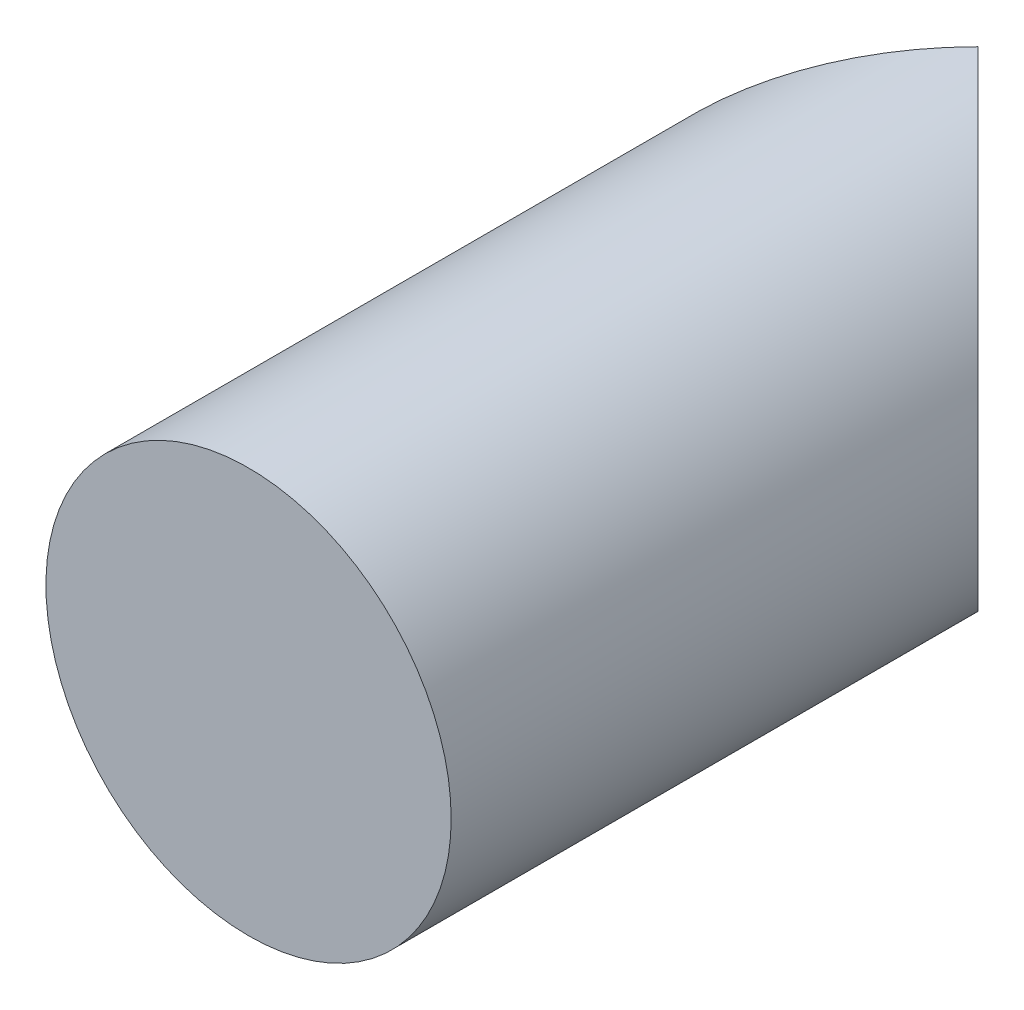
ISO-10303-21;
HEADER;
FILE_DESCRIPTION(('STEP AP214'),'2;1');
FILE_NAME('part.step','',(''),(''),'','','');
FILE_SCHEMA(('AUTOMOTIVE_DESIGN { 1 0 10303 214 1 1 1 1 }'));
ENDSEC;
DATA;
#1=APPLICATION_CONTEXT('core data for automotive mechanical design processes');
#2=APPLICATION_PROTOCOL_DEFINITION('international standard','automotive_design',2000,#1);
#3=PRODUCT_CONTEXT('',#1,'mechanical');
#4=PRODUCT('Part','Part','',(#3));
#5=PRODUCT_RELATED_PRODUCT_CATEGORY('part','',(#4));
#6=PRODUCT_DEFINITION_FORMATION('','',#4);
#7=PRODUCT_DEFINITION_CONTEXT('part definition',#1,'design');
#8=PRODUCT_DEFINITION('design','',#6,#7);
#9=PRODUCT_DEFINITION_SHAPE('','',#8);
#10=(LENGTH_UNIT() NAMED_UNIT(*) SI_UNIT(.MILLI.,.METRE.));
#11=(NAMED_UNIT(*) PLANE_ANGLE_UNIT() SI_UNIT($,.RADIAN.));
#12=(NAMED_UNIT(*) SI_UNIT($,.STERADIAN.) SOLID_ANGLE_UNIT());
#13=UNCERTAINTY_MEASURE_WITH_UNIT(LENGTH_MEASURE(1.E-05),#10,'distance_accuracy_value','');
#14=(GEOMETRIC_REPRESENTATION_CONTEXT(3) GLOBAL_UNCERTAINTY_ASSIGNED_CONTEXT((#13)) GLOBAL_UNIT_ASSIGNED_CONTEXT((#10,
#11,#12)) REPRESENTATION_CONTEXT('',''));
#15=CARTESIAN_POINT('',(0.,0.,0.));
#16=DIRECTION('',(0.,0.,1.));
#17=DIRECTION('',(1.,0.,0.));
#18=AXIS2_PLACEMENT_3D('',#15,#16,#17);
#19=CARTESIAN_POINT('',(0.,0.,45.));
#20=DIRECTION('',(0.,0.,-1.));
#21=DIRECTION('',(-1.,0.,0.));
#22=AXIS2_PLACEMENT_3D('',#19,#20,#21);
#23=CYLINDRICAL_SURFACE('',#22,12.5);
#24=CARTESIAN_POINT('',(0.,0.,45.));
#25=DIRECTION('',(0.,0.,1.));
#26=DIRECTION('',(1.,0.,0.));
#27=AXIS2_PLACEMENT_3D('',#24,#25,#26);
#28=CIRCLE('',#27,12.5);
#29=CARTESIAN_POINT('',(12.5,0.,45.));
#30=VERTEX_POINT('',#29);
#31=EDGE_CURVE('E62',#30,#30,#28,.T.);
#32=ORIENTED_EDGE('',*,*,#31,.F.);
#33=EDGE_LOOP('',(#32));
#34=FACE_BOUND('',#33,.T.);
#35=CARTESIAN_POINT('',(0.,0.,-1.11022302462516E-13));
#36=DIRECTION('',(0.707106781186551,0.,-0.707106781186543));
#37=DIRECTION('',(-0.707106781186544,0.,-0.707106781186551));
#38=AXIS2_PLACEMENT_3D('',#35,#36,#37);
#39=ELLIPSE('',#38,17.6776695296638,12.5);
#40=CARTESIAN_POINT('',(1.98924494724343E-13,12.5,0.));
#41=VERTEX_POINT('',#40);
#42=CARTESIAN_POINT('',(0.,-12.5,0.));
#43=VERTEX_POINT('',#42);
#44=EDGE_CURVE('E72',#41,#43,#39,.T.);
#45=ORIENTED_EDGE('',*,*,#44,.F.);
#46=CARTESIAN_POINT('',(0.,0.,1.11022302462516E-13));
#47=DIRECTION('',(0.707106781186545,0.,0.70710678118655));
#48=DIRECTION('',(0.70710678118655,0.,-0.707106781186545));
#49=AXIS2_PLACEMENT_3D('',#46,#47,#48);
#50=ELLIPSE('',#49,17.6776695296636,12.5);
#51=EDGE_CURVE('E68',#41,#43,#50,.T.);
#52=ORIENTED_EDGE('',*,*,#51,.T.);
#53=EDGE_LOOP('',(#45,#52));
#54=FACE_BOUND('',#53,.T.);
#55=ADVANCED_FACE('F55',(#34,#54),#23,.T.);
#56=CARTESIAN_POINT('',(0.,0.,45.));
#57=DIRECTION('',(0.,0.,1.));
#58=DIRECTION('',(1.,0.,0.));
#59=AXIS2_PLACEMENT_3D('',#56,#57,#58);
#60=PLANE('',#59);
#61=ORIENTED_EDGE('',*,*,#31,.T.);
#62=EDGE_LOOP('',(#61));
#63=FACE_BOUND('',#62,.T.);
#64=ADVANCED_FACE('F81',(#63),#60,.T.);
#65=CARTESIAN_POINT('',(1.95200653617416E-13,20.0128803703902,0.));
#66=DIRECTION('',(0.707106781186551,0.,-0.707106781186543));
#67=DIRECTION('',(-0.707106781186544,0.,-0.707106781186551));
#68=AXIS2_PLACEMENT_3D('',#65,#66,#67);
#69=PLANE('',#68);
#70=ORIENTED_EDGE('',*,*,#44,.T.);
#71=DIRECTION('',(0.,1.,0.));
#72=VECTOR('',#71,1.);
#73=CARTESIAN_POINT('',(1.11637459697271E-13,0.,0.));
#74=LINE('',#73,#72);
#75=EDGE_CURVE('E12',#43,#41,#74,.T.);
#76=ORIENTED_EDGE('',*,*,#75,.T.);
#77=EDGE_LOOP('',(#70,#76));
#78=FACE_BOUND('',#77,.T.);
#79=ADVANCED_FACE('F76',(#78),#69,.T.);
#80=CARTESIAN_POINT('',(1.95200653617415E-13,20.0128803703902,0.));
#81=DIRECTION('',(0.707106781186545,0.,0.70710678118655));
#82=DIRECTION('',(0.70710678118655,0.,-0.707106781186545));
#83=AXIS2_PLACEMENT_3D('',#80,#81,#82);
#84=PLANE('',#83);
#85=ORIENTED_EDGE('',*,*,#75,.F.);
#86=ORIENTED_EDGE('',*,*,#51,.F.);
#87=EDGE_LOOP('',(#85,#86));
#88=FACE_BOUND('',#87,.T.);
#89=ADVANCED_FACE('F74',(#88),#84,.F.);
#90=CLOSED_SHELL('',(#55,#64,#79,#89));
#91=MANIFOLD_SOLID_BREP('B2',#90);
#92=ADVANCED_BREP_SHAPE_REPRESENTATION('',(#18,#91),#14);
#93=SHAPE_DEFINITION_REPRESENTATION(#9,#92);
ENDSEC;
END-ISO-10303-21;
